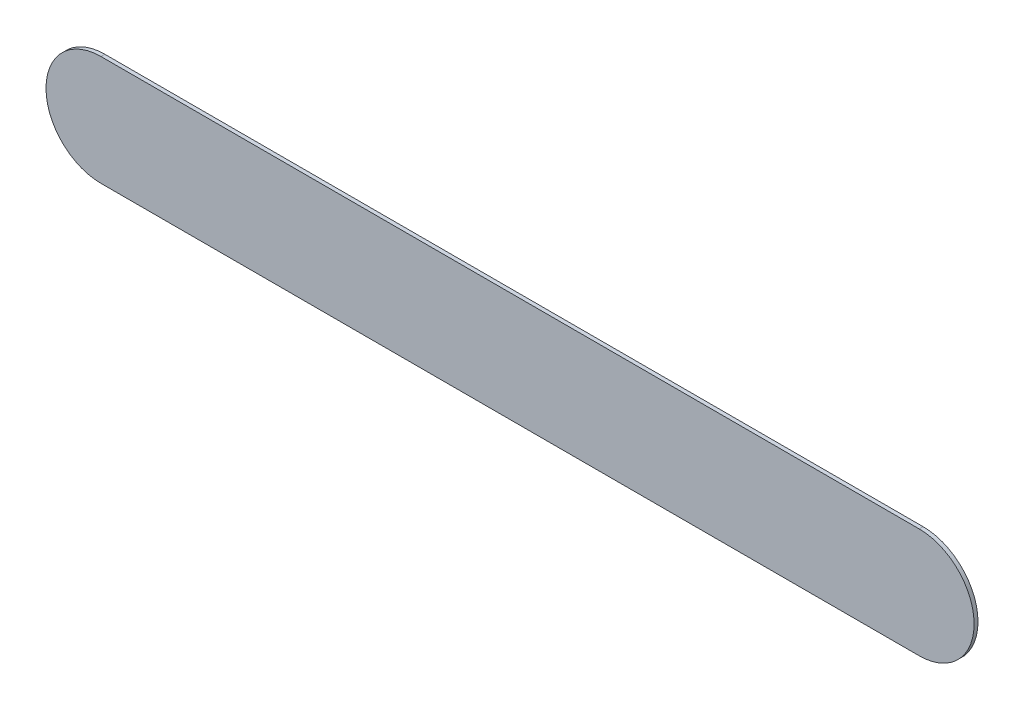
ISO-10303-21;
HEADER;
FILE_DESCRIPTION(('STEP AP214'),'2;1');
FILE_NAME('part.step','',(''),(''),'','','');
FILE_SCHEMA(('AUTOMOTIVE_DESIGN { 1 0 10303 214 1 1 1 1 }'));
ENDSEC;
DATA;
#1=APPLICATION_CONTEXT('core data for automotive mechanical design processes');
#2=APPLICATION_PROTOCOL_DEFINITION('international standard','automotive_design',2000,#1);
#3=PRODUCT_CONTEXT('',#1,'mechanical');
#4=PRODUCT('Part','Part','',(#3));
#5=PRODUCT_RELATED_PRODUCT_CATEGORY('part','',(#4));
#6=PRODUCT_DEFINITION_FORMATION('','',#4);
#7=PRODUCT_DEFINITION_CONTEXT('part definition',#1,'design');
#8=PRODUCT_DEFINITION('design','',#6,#7);
#9=PRODUCT_DEFINITION_SHAPE('','',#8);
#10=(LENGTH_UNIT() NAMED_UNIT(*) SI_UNIT(.MILLI.,.METRE.));
#11=(NAMED_UNIT(*) PLANE_ANGLE_UNIT() SI_UNIT($,.RADIAN.));
#12=(NAMED_UNIT(*) SI_UNIT($,.STERADIAN.) SOLID_ANGLE_UNIT());
#13=UNCERTAINTY_MEASURE_WITH_UNIT(LENGTH_MEASURE(1.E-05),#10,'distance_accuracy_value','');
#14=(GEOMETRIC_REPRESENTATION_CONTEXT(3) GLOBAL_UNCERTAINTY_ASSIGNED_CONTEXT((#13)) GLOBAL_UNIT_ASSIGNED_CONTEXT((#10,
#11,#12)) REPRESENTATION_CONTEXT('',''));
#15=CARTESIAN_POINT('',(0.,0.,0.));
#16=DIRECTION('',(0.,0.,1.));
#17=DIRECTION('',(1.,0.,0.));
#18=AXIS2_PLACEMENT_3D('',#15,#16,#17);
#19=CARTESIAN_POINT('',(48.09998508,60.00000192,0.));
#20=DIRECTION('',(0.,1.,0.));
#21=DIRECTION('',(1.,0.,0.));
#22=AXIS2_PLACEMENT_3D('',#19,#20,#21);
#23=PLANE('',#22);
#24=DIRECTION('',(1.,0.,0.));
#25=VECTOR('',#24,1.);
#26=CARTESIAN_POINT('',(48.09998508,60.00000192,0.03556));
#27=LINE('',#26,#25);
#28=CARTESIAN_POINT('',(48.09998508,60.00000192,0.03556));
#29=VERTEX_POINT('',#28);
#30=CARTESIAN_POINT('',(55.5462948,60.00000192,0.03556));
#31=VERTEX_POINT('',#30);
#32=EDGE_CURVE('E11',#29,#31,#27,.T.);
#33=ORIENTED_EDGE('',*,*,#32,.F.);
#34=DIRECTION('',(0.,0.,1.));
#35=VECTOR('',#34,1.);
#36=CARTESIAN_POINT('',(48.09998508,60.00000192,0.));
#37=LINE('',#36,#35);
#38=CARTESIAN_POINT('',(48.09998508,60.00000192,0.));
#39=VERTEX_POINT('',#38);
#40=EDGE_CURVE('E24',#39,#29,#37,.T.);
#41=ORIENTED_EDGE('',*,*,#40,.F.);
#42=DIRECTION('',(1.,0.,0.));
#43=VECTOR('',#42,1.);
#44=CARTESIAN_POINT('',(48.09998508,60.00000192,0.));
#45=LINE('',#44,#43);
#46=CARTESIAN_POINT('',(55.5462948,60.00000192,0.));
#47=VERTEX_POINT('',#46);
#48=EDGE_CURVE('E75',#39,#47,#45,.T.);
#49=ORIENTED_EDGE('',*,*,#48,.T.);
#50=DIRECTION('',(0.,0.,1.));
#51=VECTOR('',#50,1.);
#52=CARTESIAN_POINT('',(55.5462948,60.00000192,0.));
#53=LINE('',#52,#51);
#54=EDGE_CURVE('E37',#47,#31,#53,.T.);
#55=ORIENTED_EDGE('',*,*,#54,.T.);
#56=EDGE_LOOP('',(#33,#41,#49,#55));
#57=FACE_BOUND('',#56,.T.);
#58=ADVANCED_FACE('F17',(#57),#23,.F.);
#59=CARTESIAN_POINT('',(55.5462948,60.50000092,0.));
#60=DIRECTION('',(0.,0.,-1.));
#61=DIRECTION('',(0.,-1.,0.));
#62=AXIS2_PLACEMENT_3D('',#59,#60,#61);
#63=CYLINDRICAL_SURFACE('',#62,0.499998999999998);
#64=CARTESIAN_POINT('',(55.5462948,60.50000092,0.03556));
#65=DIRECTION('',(0.,0.,1.));
#66=DIRECTION('',(0.,-1.,0.));
#67=AXIS2_PLACEMENT_3D('',#64,#65,#66);
#68=CIRCLE('',#67,0.499998999999998);
#69=CARTESIAN_POINT('',(55.5462948,60.99999992,0.03556));
#70=VERTEX_POINT('',#69);
#71=EDGE_CURVE('E83',#31,#70,#68,.T.);
#72=ORIENTED_EDGE('',*,*,#71,.F.);
#73=ORIENTED_EDGE('',*,*,#54,.F.);
#74=CARTESIAN_POINT('',(55.5462948,60.50000092,0.));
#75=DIRECTION('',(0.,0.,1.));
#76=DIRECTION('',(0.,-1.,0.));
#77=AXIS2_PLACEMENT_3D('',#74,#75,#76);
#78=CIRCLE('',#77,0.499998999999998);
#79=CARTESIAN_POINT('',(55.5462948,60.99999992,0.));
#80=VERTEX_POINT('',#79);
#81=EDGE_CURVE('E81',#47,#80,#78,.T.);
#82=ORIENTED_EDGE('',*,*,#81,.T.);
#83=DIRECTION('',(0.,0.,1.));
#84=VECTOR('',#83,1.);
#85=CARTESIAN_POINT('',(55.5462948,60.99999992,0.));
#86=LINE('',#85,#84);
#87=EDGE_CURVE('E67',#80,#70,#86,.T.);
#88=ORIENTED_EDGE('',*,*,#87,.T.);
#89=EDGE_LOOP('',(#72,#73,#82,#88));
#90=FACE_BOUND('',#89,.T.);
#91=ADVANCED_FACE('F89',(#90),#63,.T.);
#92=CARTESIAN_POINT('',(55.5462948,60.99999992,0.));
#93=DIRECTION('',(0.,-1.,0.));
#94=DIRECTION('',(-1.,0.,0.));
#95=AXIS2_PLACEMENT_3D('',#92,#93,#94);
#96=PLANE('',#95);
#97=DIRECTION('',(-1.,0.,0.));
#98=VECTOR('',#97,1.);
#99=CARTESIAN_POINT('',(55.5462948,60.99999992,0.03556));
#100=LINE('',#99,#98);
#101=CARTESIAN_POINT('',(48.09998508,60.99999992,0.03556));
#102=VERTEX_POINT('',#101);
#103=EDGE_CURVE('E71',#70,#102,#100,.T.);
#104=ORIENTED_EDGE('',*,*,#103,.F.);
#105=ORIENTED_EDGE('',*,*,#87,.F.);
#106=DIRECTION('',(-1.,0.,0.));
#107=VECTOR('',#106,1.);
#108=CARTESIAN_POINT('',(55.5462948,60.99999992,0.));
#109=LINE('',#108,#107);
#110=CARTESIAN_POINT('',(48.09998508,60.99999992,0.));
#111=VERTEX_POINT('',#110);
#112=EDGE_CURVE('E63',#80,#111,#109,.T.);
#113=ORIENTED_EDGE('',*,*,#112,.T.);
#114=DIRECTION('',(0.,0.,1.));
#115=VECTOR('',#114,1.);
#116=CARTESIAN_POINT('',(48.09998508,60.99999992,0.));
#117=LINE('',#116,#115);
#118=EDGE_CURVE('E53',#111,#102,#117,.T.);
#119=ORIENTED_EDGE('',*,*,#118,.T.);
#120=EDGE_LOOP('',(#104,#105,#113,#119));
#121=FACE_BOUND('',#120,.T.);
#122=ADVANCED_FACE('F66',(#121),#96,.F.);
#123=CARTESIAN_POINT('',(48.09998508,60.50000092,0.));
#124=DIRECTION('',(0.,0.,-1.));
#125=DIRECTION('',(0.,1.,0.));
#126=AXIS2_PLACEMENT_3D('',#123,#124,#125);
#127=CYLINDRICAL_SURFACE('',#126,0.499998999999998);
#128=CARTESIAN_POINT('',(48.09998508,60.50000092,0.03556));
#129=DIRECTION('',(0.,0.,1.));
#130=DIRECTION('',(0.,1.,0.));
#131=AXIS2_PLACEMENT_3D('',#128,#129,#130);
#132=CIRCLE('',#131,0.499998999999998);
#133=EDGE_CURVE('E59',#102,#29,#132,.T.);
#134=ORIENTED_EDGE('',*,*,#133,.F.);
#135=ORIENTED_EDGE('',*,*,#118,.F.);
#136=CARTESIAN_POINT('',(48.09998508,60.50000092,0.));
#137=DIRECTION('',(0.,0.,1.));
#138=DIRECTION('',(0.,1.,0.));
#139=AXIS2_PLACEMENT_3D('',#136,#137,#138);
#140=CIRCLE('',#139,0.499998999999998);
#141=EDGE_CURVE('E57',#111,#39,#140,.T.);
#142=ORIENTED_EDGE('',*,*,#141,.T.);
#143=ORIENTED_EDGE('',*,*,#40,.T.);
#144=EDGE_LOOP('',(#134,#135,#142,#143));
#145=FACE_BOUND('',#144,.T.);
#146=ADVANCED_FACE('F55',(#145),#127,.T.);
#147=CARTESIAN_POINT('',(48.09998508,60.00000192,0.));
#148=DIRECTION('',(0.,0.,-1.));
#149=DIRECTION('',(-1.,0.,0.));
#150=AXIS2_PLACEMENT_3D('',#147,#148,#149);
#151=PLANE('',#150);
#152=ORIENTED_EDGE('',*,*,#141,.F.);
#153=ORIENTED_EDGE('',*,*,#112,.F.);
#154=ORIENTED_EDGE('',*,*,#81,.F.);
#155=ORIENTED_EDGE('',*,*,#48,.F.);
#156=EDGE_LOOP('',(#152,#153,#154,#155));
#157=FACE_BOUND('',#156,.T.);
#158=ADVANCED_FACE('F74',(#157),#151,.T.);
#159=CARTESIAN_POINT('',(48.09998508,60.00000192,0.03556));
#160=DIRECTION('',(0.,0.,-1.));
#161=DIRECTION('',(-1.,0.,0.));
#162=AXIS2_PLACEMENT_3D('',#159,#160,#161);
#163=PLANE('',#162);
#164=ORIENTED_EDGE('',*,*,#32,.T.);
#165=ORIENTED_EDGE('',*,*,#71,.T.);
#166=ORIENTED_EDGE('',*,*,#103,.T.);
#167=ORIENTED_EDGE('',*,*,#133,.T.);
#168=EDGE_LOOP('',(#164,#165,#166,#167));
#169=FACE_BOUND('',#168,.T.);
#170=ADVANCED_FACE('F91',(#169),#163,.F.);
#171=CLOSED_SHELL('',(#58,#91,#122,#146,#158,#170));
#172=MANIFOLD_SOLID_BREP('B1',#171);
#173=ADVANCED_BREP_SHAPE_REPRESENTATION('',(#18,#172),#14);
#174=SHAPE_DEFINITION_REPRESENTATION(#9,#173);
ENDSEC;
END-ISO-10303-21;
